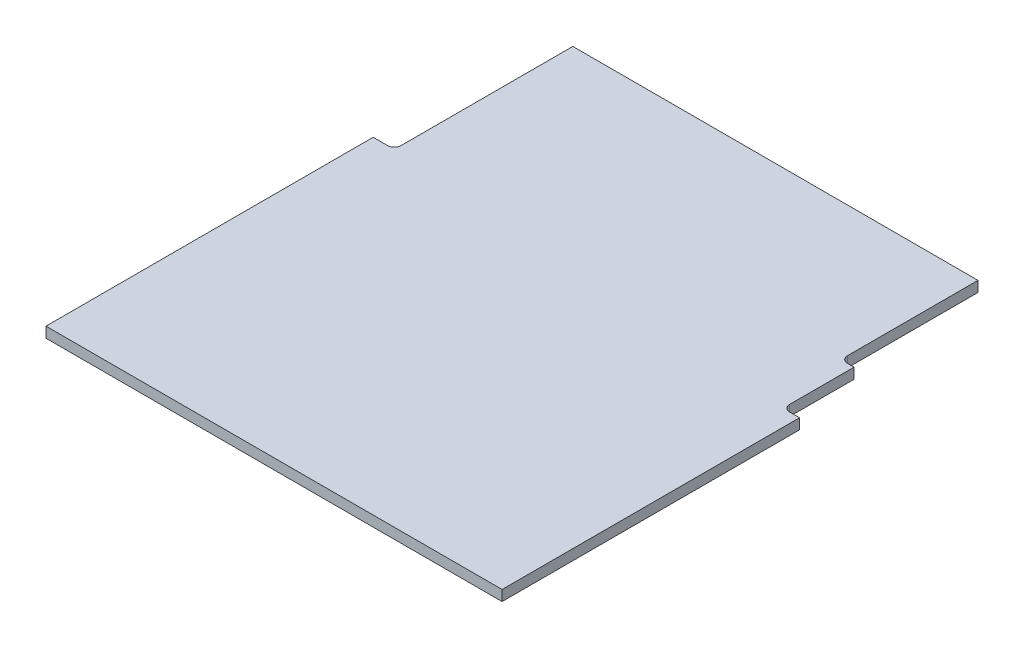
ISO-10303-21;
HEADER;
FILE_DESCRIPTION(('STEP AP214'),'2;1');
FILE_NAME('part.step','',(''),(''),'','','');
FILE_SCHEMA(('AUTOMOTIVE_DESIGN { 1 0 10303 214 1 1 1 1 }'));
ENDSEC;
DATA;
#1=APPLICATION_CONTEXT('core data for automotive mechanical design processes');
#2=APPLICATION_PROTOCOL_DEFINITION('international standard','automotive_design',2000,#1);
#3=PRODUCT_CONTEXT('',#1,'mechanical');
#4=PRODUCT('Part','Part','',(#3));
#5=PRODUCT_RELATED_PRODUCT_CATEGORY('part','',(#4));
#6=PRODUCT_DEFINITION_FORMATION('','',#4);
#7=PRODUCT_DEFINITION_CONTEXT('part definition',#1,'design');
#8=PRODUCT_DEFINITION('design','',#6,#7);
#9=PRODUCT_DEFINITION_SHAPE('','',#8);
#10=(LENGTH_UNIT() NAMED_UNIT(*) SI_UNIT(.MILLI.,.METRE.));
#11=(NAMED_UNIT(*) PLANE_ANGLE_UNIT() SI_UNIT($,.RADIAN.));
#12=(NAMED_UNIT(*) SI_UNIT($,.STERADIAN.) SOLID_ANGLE_UNIT());
#13=UNCERTAINTY_MEASURE_WITH_UNIT(LENGTH_MEASURE(1.E-05),#10,'distance_accuracy_value','');
#14=(GEOMETRIC_REPRESENTATION_CONTEXT(3) GLOBAL_UNCERTAINTY_ASSIGNED_CONTEXT((#13)) GLOBAL_UNIT_ASSIGNED_CONTEXT((#10,
#11,#12)) REPRESENTATION_CONTEXT('',''));
#15=CARTESIAN_POINT('',(0.,0.,0.));
#16=DIRECTION('',(0.,0.,1.));
#17=DIRECTION('',(1.,0.,0.));
#18=AXIS2_PLACEMENT_3D('',#15,#16,#17);
#19=CARTESIAN_POINT('',(-34.5,1.5875,-40.5));
#20=DIRECTION('',(1.,0.,0.));
#21=DIRECTION('',(0.,0.,-1.));
#22=AXIS2_PLACEMENT_3D('',#19,#20,#21);
#23=PLANE('',#22);
#24=DIRECTION('',(0.,0.,1.));
#25=VECTOR('',#24,1.);
#26=CARTESIAN_POINT('',(-34.5,0.,-40.5));
#27=LINE('',#26,#25);
#28=CARTESIAN_POINT('',(-34.5,0.,-40.5));
#29=VERTEX_POINT('',#28);
#30=CARTESIAN_POINT('',(-34.5,0.,9.));
#31=VERTEX_POINT('',#30);
#32=EDGE_CURVE('E159',#29,#31,#27,.T.);
#33=ORIENTED_EDGE('',*,*,#32,.T.);
#34=DIRECTION('',(0.,-1.,0.));
#35=VECTOR('',#34,1.);
#36=CARTESIAN_POINT('',(-34.5,1.5875,9.));
#37=LINE('',#36,#35);
#38=CARTESIAN_POINT('',(-34.5,1.5875,9.));
#39=VERTEX_POINT('',#38);
#40=EDGE_CURVE('E11',#39,#31,#37,.T.);
#41=ORIENTED_EDGE('',*,*,#40,.F.);
#42=DIRECTION('',(0.,0.,1.));
#43=VECTOR('',#42,1.);
#44=CARTESIAN_POINT('',(-34.5,1.5875,-40.5));
#45=LINE('',#44,#43);
#46=CARTESIAN_POINT('',(-34.5,1.5875,-40.5));
#47=VERTEX_POINT('',#46);
#48=EDGE_CURVE('E183',#47,#39,#45,.T.);
#49=ORIENTED_EDGE('',*,*,#48,.F.);
#50=DIRECTION('',(0.,-1.,0.));
#51=VECTOR('',#50,1.);
#52=CARTESIAN_POINT('',(-34.5,1.5875,-40.5));
#53=LINE('',#52,#51);
#54=EDGE_CURVE('E155',#47,#29,#53,.T.);
#55=ORIENTED_EDGE('',*,*,#54,.T.);
#56=EDGE_LOOP('',(#33,#41,#49,#55));
#57=FACE_BOUND('',#56,.T.);
#58=ADVANCED_FACE('F33',(#57),#23,.F.);
#59=CARTESIAN_POINT('',(-34.5,1.5875,9.));
#60=DIRECTION('',(0.,0.,-1.));
#61=DIRECTION('',(-1.,0.,0.));
#62=AXIS2_PLACEMENT_3D('',#59,#60,#61);
#63=PLANE('',#62);
#64=DIRECTION('',(1.,0.,0.));
#65=VECTOR('',#64,1.);
#66=CARTESIAN_POINT('',(-34.5,0.,9.));
#67=LINE('',#66,#65);
#68=CARTESIAN_POINT('',(34.5,0.,9.));
#69=VERTEX_POINT('',#68);
#70=EDGE_CURVE('E162',#31,#69,#67,.T.);
#71=ORIENTED_EDGE('',*,*,#70,.T.);
#72=DIRECTION('',(0.,-1.,0.));
#73=VECTOR('',#72,1.);
#74=CARTESIAN_POINT('',(34.5,1.5875,9.));
#75=LINE('',#74,#73);
#76=CARTESIAN_POINT('',(34.5,1.5875,9.));
#77=VERTEX_POINT('',#76);
#78=EDGE_CURVE('E41',#77,#69,#75,.T.);
#79=ORIENTED_EDGE('',*,*,#78,.F.);
#80=DIRECTION('',(1.,0.,0.));
#81=VECTOR('',#80,1.);
#82=CARTESIAN_POINT('',(-34.5,1.5875,9.));
#83=LINE('',#82,#81);
#84=EDGE_CURVE('E107',#39,#77,#83,.T.);
#85=ORIENTED_EDGE('',*,*,#84,.F.);
#86=ORIENTED_EDGE('',*,*,#40,.T.);
#87=EDGE_LOOP('',(#71,#79,#85,#86));
#88=FACE_BOUND('',#87,.T.);
#89=ADVANCED_FACE('F266',(#88),#63,.F.);
#90=CARTESIAN_POINT('',(34.5,1.5875,9.));
#91=DIRECTION('',(-1.,0.,0.));
#92=DIRECTION('',(0.,0.,1.));
#93=AXIS2_PLACEMENT_3D('',#90,#91,#92);
#94=PLANE('',#93);
#95=DIRECTION('',(0.,0.,-1.));
#96=VECTOR('',#95,1.);
#97=CARTESIAN_POINT('',(34.5,0.,9.));
#98=LINE('',#97,#96);
#99=CARTESIAN_POINT('',(34.5,0.,-36.));
#100=VERTEX_POINT('',#99);
#101=EDGE_CURVE('E164',#69,#100,#98,.T.);
#102=ORIENTED_EDGE('',*,*,#101,.T.);
#103=DIRECTION('',(0.,-1.,0.));
#104=VECTOR('',#103,1.);
#105=CARTESIAN_POINT('',(34.5,1.5875,-36.));
#106=LINE('',#105,#104);
#107=CARTESIAN_POINT('',(34.5,1.5875,-36.));
#108=VERTEX_POINT('',#107);
#109=EDGE_CURVE('E205',#108,#100,#106,.T.);
#110=ORIENTED_EDGE('',*,*,#109,.F.);
#111=DIRECTION('',(0.,0.,-1.));
#112=VECTOR('',#111,1.);
#113=CARTESIAN_POINT('',(34.5,1.5875,9.));
#114=LINE('',#113,#112);
#115=EDGE_CURVE('E213',#77,#108,#114,.T.);
#116=ORIENTED_EDGE('',*,*,#115,.F.);
#117=ORIENTED_EDGE('',*,*,#78,.T.);
#118=EDGE_LOOP('',(#102,#110,#116,#117));
#119=FACE_BOUND('',#118,.T.);
#120=ADVANCED_FACE('F211',(#119),#94,.F.);
#121=CARTESIAN_POINT('',(32.9400076515611,1.5875,-36.));
#122=DIRECTION('',(0.,0.,1.));
#123=DIRECTION('',(1.,0.,0.));
#124=AXIS2_PLACEMENT_3D('',#121,#122,#123);
#125=PLANE('',#124);
#126=DIRECTION('',(-1.,0.,0.));
#127=VECTOR('',#126,1.);
#128=CARTESIAN_POINT('',(32.9400076515611,0.,-36.));
#129=LINE('',#128,#127);
#130=CARTESIAN_POINT('',(32.9400076515611,0.,-36.));
#131=VERTEX_POINT('',#130);
#132=EDGE_CURVE('E166',#100,#131,#129,.T.);
#133=ORIENTED_EDGE('',*,*,#132,.T.);
#134=DIRECTION('',(0.,-1.,0.));
#135=VECTOR('',#134,1.);
#136=CARTESIAN_POINT('',(32.9400076515611,1.5875,-36.));
#137=LINE('',#136,#135);
#138=CARTESIAN_POINT('',(32.9400076515611,1.5875,-36.));
#139=VERTEX_POINT('',#138);
#140=EDGE_CURVE('E202',#139,#131,#137,.T.);
#141=ORIENTED_EDGE('',*,*,#140,.F.);
#142=DIRECTION('',(-1.,0.,0.));
#143=VECTOR('',#142,1.);
#144=CARTESIAN_POINT('',(32.9400076515611,1.5875,-36.));
#145=LINE('',#144,#143);
#146=EDGE_CURVE('E231',#108,#139,#145,.T.);
#147=ORIENTED_EDGE('',*,*,#146,.F.);
#148=ORIENTED_EDGE('',*,*,#109,.T.);
#149=EDGE_LOOP('',(#133,#141,#147,#148));
#150=FACE_BOUND('',#149,.T.);
#151=ADVANCED_FACE('F222',(#150),#125,.F.);
#152=CARTESIAN_POINT('',(33.0019143896676,1.5875,-37.));
#153=DIRECTION('',(0.,-1.,0.));
#154=DIRECTION('',(0.,0.,-1.));
#155=AXIS2_PLACEMENT_3D('',#152,#153,#154);
#156=CYLINDRICAL_SURFACE('',#155,1.0019143896676);
#157=CARTESIAN_POINT('',(33.0019143896676,0.,-37.));
#158=DIRECTION('',(0.,-1.,0.));
#159=DIRECTION('',(0.,0.,1.));
#160=AXIS2_PLACEMENT_3D('',#157,#158,#159);
#161=CIRCLE('',#160,1.0019143896676);
#162=CARTESIAN_POINT('',(32.,0.,-37.));
#163=VERTEX_POINT('',#162);
#164=EDGE_CURVE('E168',#131,#163,#161,.T.);
#165=ORIENTED_EDGE('',*,*,#164,.T.);
#166=DIRECTION('',(0.,-1.,0.));
#167=VECTOR('',#166,1.);
#168=CARTESIAN_POINT('',(32.,1.5875,-37.));
#169=LINE('',#168,#167);
#170=CARTESIAN_POINT('',(32.,1.5875,-37.));
#171=VERTEX_POINT('',#170);
#172=EDGE_CURVE('E199',#171,#163,#169,.T.);
#173=ORIENTED_EDGE('',*,*,#172,.F.);
#174=CARTESIAN_POINT('',(33.0019143896676,1.5875,-37.));
#175=DIRECTION('',(0.,-1.,0.));
#176=DIRECTION('',(0.,0.,1.));
#177=AXIS2_PLACEMENT_3D('',#174,#175,#176);
#178=CIRCLE('',#177,1.0019143896676);
#179=EDGE_CURVE('E228',#139,#171,#178,.T.);
#180=ORIENTED_EDGE('',*,*,#179,.F.);
#181=ORIENTED_EDGE('',*,*,#140,.T.);
#182=EDGE_LOOP('',(#165,#173,#180,#181));
#183=FACE_BOUND('',#182,.T.);
#184=ADVANCED_FACE('F226',(#183),#156,.F.);
#185=CARTESIAN_POINT('',(32.,1.5875,-46.75));
#186=DIRECTION('',(-1.,0.,0.));
#187=DIRECTION('',(0.,0.,1.));
#188=AXIS2_PLACEMENT_3D('',#185,#186,#187);
#189=PLANE('',#188);
#190=DIRECTION('',(0.,0.,-1.));
#191=VECTOR('',#190,1.);
#192=CARTESIAN_POINT('',(32.,0.,-46.75));
#193=LINE('',#192,#191);
#194=CARTESIAN_POINT('',(32.,0.,-46.75));
#195=VERTEX_POINT('',#194);
#196=EDGE_CURVE('E170',#163,#195,#193,.T.);
#197=ORIENTED_EDGE('',*,*,#196,.T.);
#198=DIRECTION('',(0.,-1.,0.));
#199=VECTOR('',#198,1.);
#200=CARTESIAN_POINT('',(32.,1.5875,-46.75));
#201=LINE('',#200,#199);
#202=CARTESIAN_POINT('',(32.,1.5875,-46.75));
#203=VERTEX_POINT('',#202);
#204=EDGE_CURVE('E196',#203,#195,#201,.T.);
#205=ORIENTED_EDGE('',*,*,#204,.F.);
#206=DIRECTION('',(0.,0.,-1.));
#207=VECTOR('',#206,1.);
#208=CARTESIAN_POINT('',(32.,1.5875,-46.75));
#209=LINE('',#208,#207);
#210=EDGE_CURVE('E230',#171,#203,#209,.T.);
#211=ORIENTED_EDGE('',*,*,#210,.F.);
#212=ORIENTED_EDGE('',*,*,#172,.T.);
#213=EDGE_LOOP('',(#197,#205,#211,#212));
#214=FACE_BOUND('',#213,.T.);
#215=ADVANCED_FACE('F279',(#214),#189,.F.);
#216=CARTESIAN_POINT('',(31.,1.5875,-46.75));
#217=DIRECTION('',(0.,0.,1.));
#218=DIRECTION('',(1.,0.,0.));
#219=AXIS2_PLACEMENT_3D('',#216,#217,#218);
#220=PLANE('',#219);
#221=DIRECTION('',(-1.,0.,0.));
#222=VECTOR('',#221,1.);
#223=CARTESIAN_POINT('',(31.,0.,-46.75));
#224=LINE('',#223,#222);
#225=CARTESIAN_POINT('',(31.,0.,-46.75));
#226=VERTEX_POINT('',#225);
#227=EDGE_CURVE('E172',#195,#226,#224,.T.);
#228=ORIENTED_EDGE('',*,*,#227,.T.);
#229=DIRECTION('',(0.,-1.,0.));
#230=VECTOR('',#229,1.);
#231=CARTESIAN_POINT('',(31.,1.5875,-46.75));
#232=LINE('',#231,#230);
#233=CARTESIAN_POINT('',(31.,1.5875,-46.75));
#234=VERTEX_POINT('',#233);
#235=EDGE_CURVE('E193',#234,#226,#232,.T.);
#236=ORIENTED_EDGE('',*,*,#235,.F.);
#237=DIRECTION('',(-1.,0.,0.));
#238=VECTOR('',#237,1.);
#239=CARTESIAN_POINT('',(31.,1.5875,-46.75));
#240=LINE('',#239,#238);
#241=EDGE_CURVE('E233',#203,#234,#240,.T.);
#242=ORIENTED_EDGE('',*,*,#241,.F.);
#243=ORIENTED_EDGE('',*,*,#204,.T.);
#244=EDGE_LOOP('',(#228,#236,#242,#243));
#245=FACE_BOUND('',#244,.T.);
#246=ADVANCED_FACE('F282',(#245),#220,.F.);
#247=CARTESIAN_POINT('',(31.,1.5875,-47.75));
#248=DIRECTION('',(0.,-1.,0.));
#249=DIRECTION('',(0.,0.,-1.));
#250=AXIS2_PLACEMENT_3D('',#247,#248,#249);
#251=CYLINDRICAL_SURFACE('',#250,1.);
#252=CARTESIAN_POINT('',(31.,0.,-47.75));
#253=DIRECTION('',(0.,-1.,0.));
#254=DIRECTION('',(0.,0.,1.));
#255=AXIS2_PLACEMENT_3D('',#252,#253,#254);
#256=CIRCLE('',#255,1.);
#257=CARTESIAN_POINT('',(30.,0.,-47.75));
#258=VERTEX_POINT('',#257);
#259=EDGE_CURVE('E174',#226,#258,#256,.T.);
#260=ORIENTED_EDGE('',*,*,#259,.T.);
#261=DIRECTION('',(0.,-1.,0.));
#262=VECTOR('',#261,1.);
#263=CARTESIAN_POINT('',(30.,1.5875,-47.75));
#264=LINE('',#263,#262);
#265=CARTESIAN_POINT('',(30.,1.5875,-47.75));
#266=VERTEX_POINT('',#265);
#267=EDGE_CURVE('E190',#266,#258,#264,.T.);
#268=ORIENTED_EDGE('',*,*,#267,.F.);
#269=CARTESIAN_POINT('',(31.,1.5875,-47.75));
#270=DIRECTION('',(0.,-1.,0.));
#271=DIRECTION('',(0.,0.,1.));
#272=AXIS2_PLACEMENT_3D('',#269,#270,#271);
#273=CIRCLE('',#272,1.);
#274=EDGE_CURVE('E239',#234,#266,#273,.T.);
#275=ORIENTED_EDGE('',*,*,#274,.F.);
#276=ORIENTED_EDGE('',*,*,#235,.T.);
#277=EDGE_LOOP('',(#260,#268,#275,#276));
#278=FACE_BOUND('',#277,.T.);
#279=ADVANCED_FACE('F286',(#278),#251,.F.);
#280=CARTESIAN_POINT('',(30.,1.5875,-67.5));
#281=DIRECTION('',(-1.,0.,0.));
#282=DIRECTION('',(0.,0.,1.));
#283=AXIS2_PLACEMENT_3D('',#280,#281,#282);
#284=PLANE('',#283);
#285=DIRECTION('',(0.,0.,-1.));
#286=VECTOR('',#285,1.);
#287=CARTESIAN_POINT('',(30.,0.,-67.5));
#288=LINE('',#287,#286);
#289=CARTESIAN_POINT('',(30.,0.,-67.5));
#290=VERTEX_POINT('',#289);
#291=EDGE_CURVE('E176',#258,#290,#288,.T.);
#292=ORIENTED_EDGE('',*,*,#291,.T.);
#293=DIRECTION('',(0.,-1.,0.));
#294=VECTOR('',#293,1.);
#295=CARTESIAN_POINT('',(30.,1.5875,-67.5));
#296=LINE('',#295,#294);
#297=CARTESIAN_POINT('',(30.,1.5875,-67.5));
#298=VERTEX_POINT('',#297);
#299=EDGE_CURVE('E187',#298,#290,#296,.T.);
#300=ORIENTED_EDGE('',*,*,#299,.F.);
#301=DIRECTION('',(0.,0.,-1.));
#302=VECTOR('',#301,1.);
#303=CARTESIAN_POINT('',(30.,1.5875,-67.5));
#304=LINE('',#303,#302);
#305=EDGE_CURVE('E241',#266,#298,#304,.T.);
#306=ORIENTED_EDGE('',*,*,#305,.F.);
#307=ORIENTED_EDGE('',*,*,#267,.T.);
#308=EDGE_LOOP('',(#292,#300,#306,#307));
#309=FACE_BOUND('',#308,.T.);
#310=ADVANCED_FACE('F247',(#309),#284,.F.);
#311=CARTESIAN_POINT('',(30.,1.5875,-67.5));
#312=DIRECTION('',(0.,0.,1.));
#313=DIRECTION('',(1.,0.,0.));
#314=AXIS2_PLACEMENT_3D('',#311,#312,#313);
#315=PLANE('',#314);
#316=DIRECTION('',(-1.,0.,0.));
#317=VECTOR('',#316,1.);
#318=CARTESIAN_POINT('',(30.,0.,-67.5));
#319=LINE('',#318,#317);
#320=CARTESIAN_POINT('',(-31.3000000000001,0.,-67.5));
#321=VERTEX_POINT('',#320);
#322=EDGE_CURVE('E178',#290,#321,#319,.T.);
#323=ORIENTED_EDGE('',*,*,#322,.T.);
#324=DIRECTION('',(0.,-1.,0.));
#325=VECTOR('',#324,1.);
#326=CARTESIAN_POINT('',(-31.3000000000001,1.5875,-67.5));
#327=LINE('',#326,#325);
#328=CARTESIAN_POINT('',(-31.3000000000001,1.5875,-67.5));
#329=VERTEX_POINT('',#328);
#330=EDGE_CURVE('E150',#329,#321,#327,.T.);
#331=ORIENTED_EDGE('',*,*,#330,.F.);
#332=DIRECTION('',(-1.,0.,0.));
#333=VECTOR('',#332,1.);
#334=CARTESIAN_POINT('',(30.,1.5875,-67.5));
#335=LINE('',#334,#333);
#336=EDGE_CURVE('E141',#298,#329,#335,.T.);
#337=ORIENTED_EDGE('',*,*,#336,.F.);
#338=ORIENTED_EDGE('',*,*,#299,.T.);
#339=EDGE_LOOP('',(#323,#331,#337,#338));
#340=FACE_BOUND('',#339,.T.);
#341=ADVANCED_FACE('F251',(#340),#315,.F.);
#342=CARTESIAN_POINT('',(-31.3000000000001,1.5875,-67.5));
#343=DIRECTION('',(1.,0.,0.));
#344=DIRECTION('',(0.,0.,-1.));
#345=AXIS2_PLACEMENT_3D('',#342,#343,#344);
#346=PLANE('',#345);
#347=DIRECTION('',(0.,0.,1.));
#348=VECTOR('',#347,1.);
#349=CARTESIAN_POINT('',(-31.3000000000001,0.,-67.5));
#350=LINE('',#349,#348);
#351=CARTESIAN_POINT('',(-31.3000000000001,0.,-41.5));
#352=VERTEX_POINT('',#351);
#353=EDGE_CURVE('E149',#321,#352,#350,.T.);
#354=ORIENTED_EDGE('',*,*,#353,.T.);
#355=DIRECTION('',(0.,-1.,0.));
#356=VECTOR('',#355,1.);
#357=CARTESIAN_POINT('',(-31.3000000000001,1.5875,-41.5));
#358=LINE('',#357,#356);
#359=CARTESIAN_POINT('',(-31.3000000000001,1.5875,-41.5));
#360=VERTEX_POINT('',#359);
#361=EDGE_CURVE('E146',#360,#352,#358,.T.);
#362=ORIENTED_EDGE('',*,*,#361,.F.);
#363=DIRECTION('',(0.,0.,1.));
#364=VECTOR('',#363,1.);
#365=CARTESIAN_POINT('',(-31.3000000000001,1.5875,-67.5));
#366=LINE('',#365,#364);
#367=EDGE_CURVE('E135',#329,#360,#366,.T.);
#368=ORIENTED_EDGE('',*,*,#367,.F.);
#369=ORIENTED_EDGE('',*,*,#330,.T.);
#370=EDGE_LOOP('',(#354,#362,#368,#369));
#371=FACE_BOUND('',#370,.T.);
#372=ADVANCED_FACE('F147',(#371),#346,.F.);
#373=CARTESIAN_POINT('',(-32.3036132359723,1.5875,-41.5));
#374=DIRECTION('',(0.,-1.,0.));
#375=DIRECTION('',(0.,0.,-1.));
#376=AXIS2_PLACEMENT_3D('',#373,#374,#375);
#377=CYLINDRICAL_SURFACE('',#376,1.0036132359722);
#378=CARTESIAN_POINT('',(-32.3036132359723,0.,-41.5));
#379=DIRECTION('',(0.,-1.,0.));
#380=DIRECTION('',(0.,0.,-1.));
#381=AXIS2_PLACEMENT_3D('',#378,#379,#380);
#382=CIRCLE('',#381,1.0036132359722);
#383=CARTESIAN_POINT('',(-32.2185278234824,0.,-40.5));
#384=VERTEX_POINT('',#383);
#385=EDGE_CURVE('E93',#352,#384,#382,.T.);
#386=ORIENTED_EDGE('',*,*,#385,.T.);
#387=DIRECTION('',(0.,-1.,0.));
#388=VECTOR('',#387,1.);
#389=CARTESIAN_POINT('',(-32.2185278234824,1.5875,-40.5));
#390=LINE('',#389,#388);
#391=CARTESIAN_POINT('',(-32.2185278234824,1.5875,-40.5));
#392=VERTEX_POINT('',#391);
#393=EDGE_CURVE('E151',#392,#384,#390,.T.);
#394=ORIENTED_EDGE('',*,*,#393,.F.);
#395=CARTESIAN_POINT('',(-32.3036132359723,1.5875,-41.5));
#396=DIRECTION('',(0.,-1.,0.));
#397=DIRECTION('',(0.,0.,-1.));
#398=AXIS2_PLACEMENT_3D('',#395,#396,#397);
#399=CIRCLE('',#398,1.0036132359722);
#400=EDGE_CURVE('E139',#360,#392,#399,.T.);
#401=ORIENTED_EDGE('',*,*,#400,.F.);
#402=ORIENTED_EDGE('',*,*,#361,.T.);
#403=EDGE_LOOP('',(#386,#394,#401,#402));
#404=FACE_BOUND('',#403,.T.);
#405=ADVANCED_FACE('F153',(#404),#377,.F.);
#406=CARTESIAN_POINT('',(-32.2185278234824,1.5875,-40.5));
#407=DIRECTION('',(0.,0.,1.));
#408=DIRECTION('',(1.,0.,0.));
#409=AXIS2_PLACEMENT_3D('',#406,#407,#408);
#410=PLANE('',#409);
#411=DIRECTION('',(-1.,0.,0.));
#412=VECTOR('',#411,1.);
#413=CARTESIAN_POINT('',(-32.2185278234824,0.,-40.5));
#414=LINE('',#413,#412);
#415=EDGE_CURVE('E99',#384,#29,#414,.T.);
#416=ORIENTED_EDGE('',*,*,#415,.T.);
#417=ORIENTED_EDGE('',*,*,#54,.F.);
#418=DIRECTION('',(-1.,0.,0.));
#419=VECTOR('',#418,1.);
#420=CARTESIAN_POINT('',(-32.2185278234824,1.5875,-40.5));
#421=LINE('',#420,#419);
#422=EDGE_CURVE('E49',#392,#47,#421,.T.);
#423=ORIENTED_EDGE('',*,*,#422,.F.);
#424=ORIENTED_EDGE('',*,*,#393,.T.);
#425=EDGE_LOOP('',(#416,#417,#423,#424));
#426=FACE_BOUND('',#425,.T.);
#427=ADVANCED_FACE('F255',(#426),#410,.F.);
#428=CARTESIAN_POINT('',(33.0019143896676,1.5875,-37.));
#429=DIRECTION('',(0.,1.,0.));
#430=DIRECTION('',(0.,0.,1.));
#431=AXIS2_PLACEMENT_3D('',#428,#429,#430);
#432=PLANE('',#431);
#433=ORIENTED_EDGE('',*,*,#48,.T.);
#434=ORIENTED_EDGE('',*,*,#84,.T.);
#435=ORIENTED_EDGE('',*,*,#115,.T.);
#436=ORIENTED_EDGE('',*,*,#146,.T.);
#437=ORIENTED_EDGE('',*,*,#179,.T.);
#438=ORIENTED_EDGE('',*,*,#210,.T.);
#439=ORIENTED_EDGE('',*,*,#241,.T.);
#440=ORIENTED_EDGE('',*,*,#274,.T.);
#441=ORIENTED_EDGE('',*,*,#305,.T.);
#442=ORIENTED_EDGE('',*,*,#336,.T.);
#443=ORIENTED_EDGE('',*,*,#367,.T.);
#444=ORIENTED_EDGE('',*,*,#400,.T.);
#445=ORIENTED_EDGE('',*,*,#422,.T.);
#446=EDGE_LOOP('',(#433,#434,#435,#436,#437,#438,#439,#440,#441,#442,#443,#444,#445));
#447=FACE_BOUND('',#446,.T.);
#448=ADVANCED_FACE('F137',(#447),#432,.T.);
#449=CARTESIAN_POINT('',(33.0019143896676,0.,-37.));
#450=DIRECTION('',(0.,1.,0.));
#451=DIRECTION('',(0.,0.,1.));
#452=AXIS2_PLACEMENT_3D('',#449,#450,#451);
#453=PLANE('',#452);
#454=ORIENTED_EDGE('',*,*,#32,.F.);
#455=ORIENTED_EDGE('',*,*,#415,.F.);
#456=ORIENTED_EDGE('',*,*,#385,.F.);
#457=ORIENTED_EDGE('',*,*,#353,.F.);
#458=ORIENTED_EDGE('',*,*,#322,.F.);
#459=ORIENTED_EDGE('',*,*,#291,.F.);
#460=ORIENTED_EDGE('',*,*,#259,.F.);
#461=ORIENTED_EDGE('',*,*,#227,.F.);
#462=ORIENTED_EDGE('',*,*,#196,.F.);
#463=ORIENTED_EDGE('',*,*,#164,.F.);
#464=ORIENTED_EDGE('',*,*,#132,.F.);
#465=ORIENTED_EDGE('',*,*,#101,.F.);
#466=ORIENTED_EDGE('',*,*,#70,.F.);
#467=EDGE_LOOP('',(#454,#455,#456,#457,#458,#459,#460,#461,#462,#463,#464,#465,#466));
#468=FACE_BOUND('',#467,.T.);
#469=ADVANCED_FACE('F217',(#468),#453,.F.);
#470=CLOSED_SHELL('',(#58,#89,#120,#151,#184,#215,#246,#279,#310,#341,#372,#405,#427,#448,#469));
#471=MANIFOLD_SOLID_BREP('B2',#470);
#472=ADVANCED_BREP_SHAPE_REPRESENTATION('',(#18,#471),#14);
#473=SHAPE_DEFINITION_REPRESENTATION(#9,#472);
ENDSEC;
END-ISO-10303-21;
